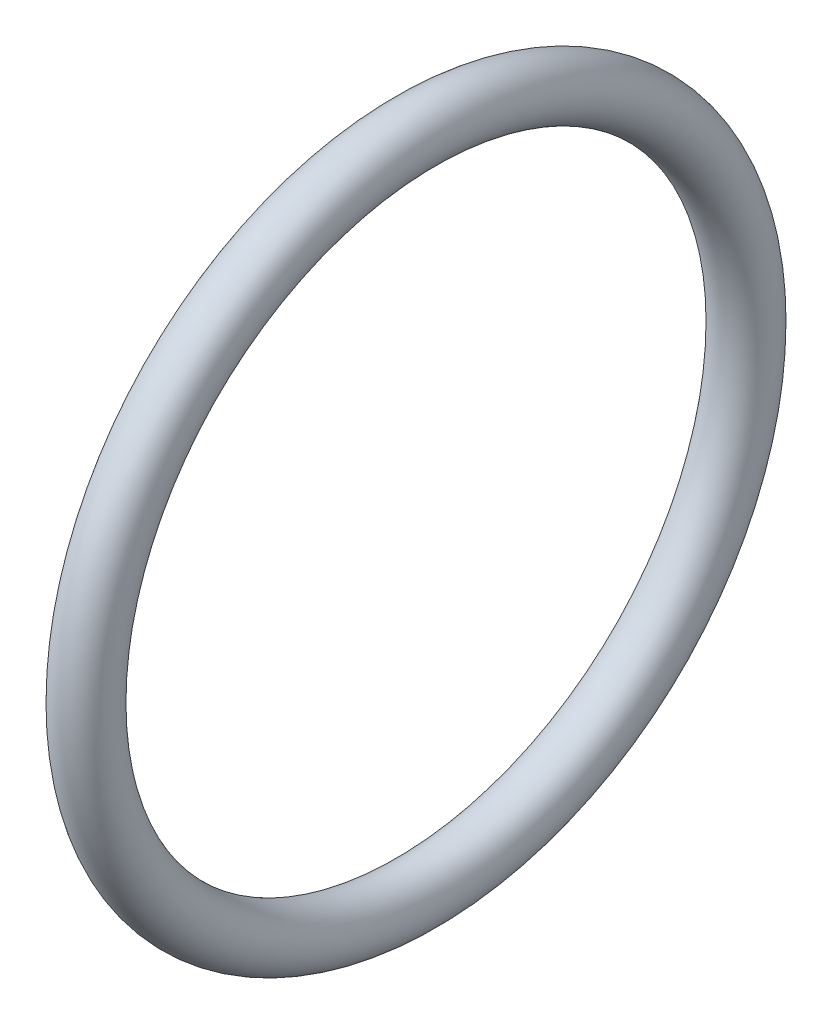
ISO-10303-21;
HEADER;
FILE_DESCRIPTION(('STEP AP214'),'2;1');
FILE_NAME('part.step','',(''),(''),'','','');
FILE_SCHEMA(('AUTOMOTIVE_DESIGN { 1 0 10303 214 1 1 1 1 }'));
ENDSEC;
DATA;
#1=APPLICATION_CONTEXT('core data for automotive mechanical design processes');
#2=APPLICATION_PROTOCOL_DEFINITION('international standard','automotive_design',2000,#1);
#3=PRODUCT_CONTEXT('',#1,'mechanical');
#4=PRODUCT('Part','Part','',(#3));
#5=PRODUCT_RELATED_PRODUCT_CATEGORY('part','',(#4));
#6=PRODUCT_DEFINITION_FORMATION('','',#4);
#7=PRODUCT_DEFINITION_CONTEXT('part definition',#1,'design');
#8=PRODUCT_DEFINITION('design','',#6,#7);
#9=PRODUCT_DEFINITION_SHAPE('','',#8);
#10=(LENGTH_UNIT() NAMED_UNIT(*) SI_UNIT(.MILLI.,.METRE.));
#11=(NAMED_UNIT(*) PLANE_ANGLE_UNIT() SI_UNIT($,.RADIAN.));
#12=(NAMED_UNIT(*) SI_UNIT($,.STERADIAN.) SOLID_ANGLE_UNIT());
#13=UNCERTAINTY_MEASURE_WITH_UNIT(LENGTH_MEASURE(1.E-05),#10,'distance_accuracy_value','');
#14=(GEOMETRIC_REPRESENTATION_CONTEXT(3) GLOBAL_UNCERTAINTY_ASSIGNED_CONTEXT((#13)) GLOBAL_UNIT_ASSIGNED_CONTEXT((#10,
#11,#12)) REPRESENTATION_CONTEXT('',''));
#15=CARTESIAN_POINT('',(0.,0.,0.));
#16=DIRECTION('',(0.,0.,1.));
#17=DIRECTION('',(1.,0.,0.));
#18=AXIS2_PLACEMENT_3D('',#15,#16,#17);
#19=CARTESIAN_POINT('',(1.125,0.,0.));
#20=DIRECTION('',(-1.,0.,0.));
#21=DIRECTION('',(0.,0.,1.));
#22=AXIS2_PLACEMENT_3D('',#19,#20,#21);
#23=TOROIDAL_SURFACE('',#22,13.125,1.125);
#24=CARTESIAN_POINT('',(1.125,0.,14.2500000000001));
#25=VERTEX_POINT('',#24);
#26=VERTEX_LOOP('',#25);
#27=FACE_BOUND('',#26,.T.);
#28=ADVANCED_FACE('F26',(#27),#23,.T.);
#29=CLOSED_SHELL('',(#28));
#30=MANIFOLD_SOLID_BREP('B2',#29);
#31=ADVANCED_BREP_SHAPE_REPRESENTATION('',(#18,#30),#14);
#32=SHAPE_DEFINITION_REPRESENTATION(#9,#31);
ENDSEC;
END-ISO-10303-21;
